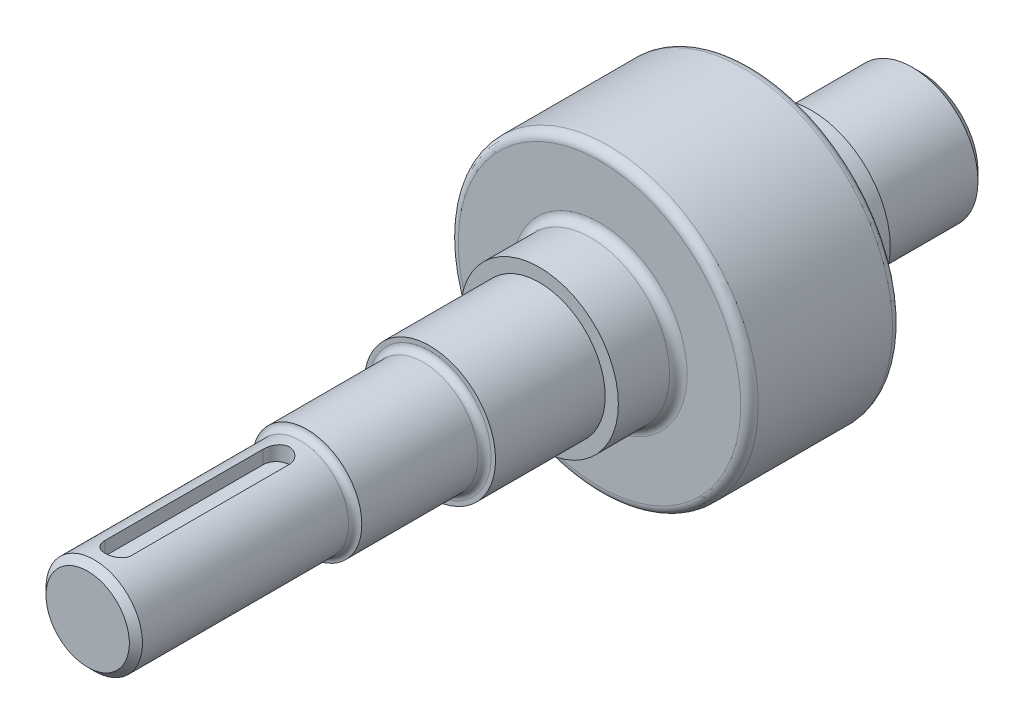
ISO-10303-21;
HEADER;
FILE_DESCRIPTION(('STEP AP214'),'2;1');
FILE_NAME('part.step','',(''),(''),'','','');
FILE_SCHEMA(('AUTOMOTIVE_DESIGN { 1 0 10303 214 1 1 1 1 }'));
ENDSEC;
DATA;
#1=APPLICATION_CONTEXT('core data for automotive mechanical design processes');
#2=APPLICATION_PROTOCOL_DEFINITION('international standard','automotive_design',2000,#1);
#3=PRODUCT_CONTEXT('',#1,'mechanical');
#4=PRODUCT('Part','Part','',(#3));
#5=PRODUCT_RELATED_PRODUCT_CATEGORY('part','',(#4));
#6=PRODUCT_DEFINITION_FORMATION('','',#4);
#7=PRODUCT_DEFINITION_CONTEXT('part definition',#1,'design');
#8=PRODUCT_DEFINITION('design','',#6,#7);
#9=PRODUCT_DEFINITION_SHAPE('','',#8);
#10=(LENGTH_UNIT() NAMED_UNIT(*) SI_UNIT(.MILLI.,.METRE.));
#11=(NAMED_UNIT(*) PLANE_ANGLE_UNIT() SI_UNIT($,.RADIAN.));
#12=(NAMED_UNIT(*) SI_UNIT($,.STERADIAN.) SOLID_ANGLE_UNIT());
#13=UNCERTAINTY_MEASURE_WITH_UNIT(LENGTH_MEASURE(1.E-05),#10,'distance_accuracy_value','');
#14=(GEOMETRIC_REPRESENTATION_CONTEXT(3) GLOBAL_UNCERTAINTY_ASSIGNED_CONTEXT((#13)) GLOBAL_UNIT_ASSIGNED_CONTEXT((#10,
#11,#12)) REPRESENTATION_CONTEXT('',''));
#15=CARTESIAN_POINT('',(0.,0.,0.));
#16=DIRECTION('',(0.,0.,1.));
#17=DIRECTION('',(1.,0.,0.));
#18=AXIS2_PLACEMENT_3D('',#15,#16,#17);
#19=CARTESIAN_POINT('',(0.,0.,0.));
#20=DIRECTION('',(0.,0.,1.));
#21=DIRECTION('',(1.,0.,0.));
#22=AXIS2_PLACEMENT_3D('',#19,#20,#21);
#23=CYLINDRICAL_SURFACE('',#22,11.);
#24=CARTESIAN_POINT('',(0.,0.,-48.5));
#25=DIRECTION('',(0.,0.,-1.));
#26=DIRECTION('',(-1.,0.,0.));
#27=AXIS2_PLACEMENT_3D('',#24,#25,#26);
#28=CIRCLE('',#27,11.);
#29=CARTESIAN_POINT('',(-11.,0.,-48.5));
#30=VERTEX_POINT('',#29);
#31=EDGE_CURVE('E271',#30,#30,#28,.F.);
#32=ORIENTED_EDGE('',*,*,#31,.T.);
#33=EDGE_LOOP('',(#32));
#34=FACE_BOUND('',#33,.T.);
#35=CARTESIAN_POINT('',(0.,0.,-1.5));
#36=DIRECTION('',(0.,0.,-1.));
#37=DIRECTION('',(-1.,0.,0.));
#38=AXIS2_PLACEMENT_3D('',#35,#36,#37);
#39=CIRCLE('',#38,11.);
#40=CARTESIAN_POINT('',(-11.,0.,-1.5));
#41=VERTEX_POINT('',#40);
#42=EDGE_CURVE('E288',#41,#41,#39,.T.);
#43=ORIENTED_EDGE('',*,*,#42,.T.);
#44=EDGE_LOOP('',(#43));
#45=FACE_BOUND('',#44,.T.);
#46=CARTESIAN_POINT('',(-3.,10.5830052442584,-43.));
#47=CARTESIAN_POINT('',(-3.00000989976809,10.5829949970026,-43.0826938914098));
#48=CARTESIAN_POINT('',(-2.99658102723594,10.5839742471726,-43.165381704592));
#49=CARTESIAN_POINT('',(-2.9829226831484,10.5878356752194,-43.3301335662288));
#50=CARTESIAN_POINT('',(-2.97269452008913,10.5907174869552,-43.4121977316291));
#51=CARTESIAN_POINT('',(-2.9455445902732,10.598299618142,-43.5749425121448));
#52=CARTESIAN_POINT('',(-2.9286377012691,10.6029958951229,-43.6556257893863));
#53=CARTESIAN_POINT('',(-2.88829120712689,10.6140571066224,-43.8152032540543));
#54=CARTESIAN_POINT('',(-2.86485147768949,10.6204220728906,-43.8940974074084));
#55=CARTESIAN_POINT('',(-2.78500332821793,10.6417494872311,-44.127242907164));
#56=CARTESIAN_POINT('',(-2.71903526586307,10.6589535681767,-44.2781393948553));
#57=CARTESIAN_POINT('',(-2.56365897700125,10.6973836998985,-44.5667053417687));
#58=CARTESIAN_POINT('',(-2.47424245636572,10.7186111730805,-44.704370097104));
#59=CARTESIAN_POINT('',(-2.27200424315806,10.7633148792344,-44.9662097059785));
#60=CARTESIAN_POINT('',(-2.15868225262836,10.7868322128172,-45.0899918782437));
#61=CARTESIAN_POINT('',(-1.91292298422355,10.8331129950831,-45.3170514389053));
#62=CARTESIAN_POINT('',(-1.78048258944453,10.8558763200935,-45.4203254772932));
#63=CARTESIAN_POINT('',(-1.49749198480952,10.8985459264206,-45.6050989067464));
#64=CARTESIAN_POINT('',(-1.34667477161624,10.9183977479742,-45.686203079821));
#65=CARTESIAN_POINT('',(-1.03291980522387,10.9525311229674,-45.8217484137797));
#66=CARTESIAN_POINT('',(-0.869984764533408,10.9668139185607,-45.8761955211319));
#67=CARTESIAN_POINT('',(-0.540744675896732,10.9879090070619,-45.9556017349027));
#68=CARTESIAN_POINT('',(-0.374613167612547,10.9948916417093,-45.9812343263694));
#69=CARTESIAN_POINT('',(-0.0402673813620298,11.0011960589752,-46.004404664847));
#70=CARTESIAN_POINT('',(0.127946573564688,11.0005190152883,-46.0019467161783));
#71=CARTESIAN_POINT('',(0.456980924404249,10.9917041066205,-45.9694751241847));
#72=CARTESIAN_POINT('',(0.617879308918079,10.9837634920705,-45.9401899732267));
#73=CARTESIAN_POINT('',(0.932383527853138,10.9615477415639,-45.8560747841413));
#74=CARTESIAN_POINT('',(1.08598900853898,10.9472722986892,-45.8012435083153));
#75=CARTESIAN_POINT('',(1.38338788045077,10.9137016176963,-45.667045133193));
#76=CARTESIAN_POINT('',(1.52706425574145,10.8943563157114,-45.5874317537612));
#77=CARTESIAN_POINT('',(1.79926098198643,10.8527253375081,-45.4061201300935));
#78=CARTESIAN_POINT('',(1.92777854091953,10.830439121215,-45.3044178271878));
#79=CARTESIAN_POINT('',(2.17034844112028,10.7844948742978,-45.0779767649162));
#80=CARTESIAN_POINT('',(2.2838069302889,10.760815765188,-44.952605446131));
#81=CARTESIAN_POINT('',(2.48826234185506,10.7153886222241,-44.6843376191299));
#82=CARTESIAN_POINT('',(2.57925300980782,10.6936411271564,-44.5414362475461));
#83=CARTESIAN_POINT('',(2.73667910615422,10.6544469945807,-44.240805187246));
#84=CARTESIAN_POINT('',(2.80293223890785,10.6370325899538,-44.0829757572429));
#85=CARTESIAN_POINT('',(2.9076832432578,10.6088816209578,-43.7579129054731));
#86=CARTESIAN_POINT('',(2.94622291362359,10.598135003286,-43.590694057725));
#87=CARTESIAN_POINT('',(2.98015870664207,10.588613232355,-43.3516455601334));
#88=CARTESIAN_POINT('',(2.98759962141261,10.5865140551644,-43.2814835402763));
#89=CARTESIAN_POINT('',(2.99751512863222,10.58371035186,-43.1408924467597));
#90=CARTESIAN_POINT('',(2.99999749605757,10.5830036423878,-43.0704639649415));
#91=CARTESIAN_POINT('',(3.00000000000001,10.5830052442584,-43.));
#92=B_SPLINE_CURVE_WITH_KNOTS('',3,(#46,#47,#48,#49,#50,#51,#52,#53,#54,#55,#56,#57,#58,#59,#60,
#61,#62,#63,#64,#65,#66,#67,#68,#69,#70,#71,#72,#73,#74,#75,#76,#77,#78,#79,#80,#81,#82,#83,#84,
#85,#86,#87,#88,#89,#90,#91),.UNSPECIFIED.,.F.,.F.,(4,2,2,2,2,2,2,2,2,2,2,2,2,2,2,2,2,2,2,2,2,2,
4),(0.,0.247994395628692,0.495941079544124,0.743338515979064,0.990740659926202,1.48499724217183,
1.97942888795731,2.48547083856628,2.99159538337128,3.50622794981868,4.02074566333957,
4.52296979924471,5.02511698025349,5.51402000992994,6.00294672920887,6.49689640600089,
6.99093691914144,7.50077286033218,8.01075056671344,8.52441550873708,9.03730408243458,
9.24891043373582,9.4601847261122),.UNSPECIFIED.);
#93=CARTESIAN_POINT('',(-3.,10.5830052442584,-43.));
#94=VERTEX_POINT('',#93);
#95=CARTESIAN_POINT('',(3.00000000000001,10.5830052442584,-43.));
#96=VERTEX_POINT('',#95);
#97=EDGE_CURVE('E90',#94,#96,#92,.T.);
#98=ORIENTED_EDGE('',*,*,#97,.T.);
#99=DIRECTION('',(0.,0.,1.));
#100=VECTOR('',#99,1.);
#101=CARTESIAN_POINT('',(3.00000000000001,10.5830052442584,0.));
#102=LINE('',#101,#100);
#103=CARTESIAN_POINT('',(3.00000000000001,10.5830052442584,-7.00000000000001));
#104=VERTEX_POINT('',#103);
#105=EDGE_CURVE('E79',#96,#104,#102,.T.);
#106=ORIENTED_EDGE('',*,*,#105,.T.);
#107=CARTESIAN_POINT('',(3.00000000000001,10.5830052442584,-7.00000000000001));
#108=CARTESIAN_POINT('',(3.0000098997681,10.5829949970026,-6.91730610859019));
#109=CARTESIAN_POINT('',(2.99658102723595,10.5839742471726,-6.83461829540797));
#110=CARTESIAN_POINT('',(2.98292268314841,10.5878356752194,-6.66986643377118));
#111=CARTESIAN_POINT('',(2.97269452008914,10.5907174869552,-6.58780226837093));
#112=CARTESIAN_POINT('',(2.94554459027321,10.598299618142,-6.42505748785524));
#113=CARTESIAN_POINT('',(2.92863770126911,10.6029958951229,-6.34437421061367));
#114=CARTESIAN_POINT('',(2.8882912071269,10.6140571066224,-6.18479674594574));
#115=CARTESIAN_POINT('',(2.8648514776895,10.6204220728906,-6.10590259259162));
#116=CARTESIAN_POINT('',(2.78500332821794,10.6417494872311,-5.872757092836));
#117=CARTESIAN_POINT('',(2.71903526586308,10.6589535681767,-5.72186060514475));
#118=CARTESIAN_POINT('',(2.56365897700126,10.6973836998985,-5.43329465823132));
#119=CARTESIAN_POINT('',(2.47424245636572,10.7186111730805,-5.29562990289597));
#120=CARTESIAN_POINT('',(2.27200424315807,10.7633148792344,-5.0337902940215));
#121=CARTESIAN_POINT('',(2.15868225262837,10.7868322128172,-4.91000812175633));
#122=CARTESIAN_POINT('',(1.91292298422355,10.8331129950831,-4.68294856109473));
#123=CARTESIAN_POINT('',(1.78048258944453,10.8558763200935,-4.57967452270675));
#124=CARTESIAN_POINT('',(1.49749198480952,10.8985459264206,-4.39490109325355));
#125=CARTESIAN_POINT('',(1.34667477161624,10.9183977479742,-4.31379692017903));
#126=CARTESIAN_POINT('',(1.03291980522387,10.9525311229674,-4.17825158622032));
#127=CARTESIAN_POINT('',(0.869984764533413,10.9668139185607,-4.12380447886811));
#128=CARTESIAN_POINT('',(0.540744675896737,10.9879090070619,-4.0443982650973));
#129=CARTESIAN_POINT('',(0.374613167612552,10.9948916417093,-4.01876567363063));
#130=CARTESIAN_POINT('',(0.0402673813620354,11.0011960589752,-3.99559533515301));
#131=CARTESIAN_POINT('',(-0.127946573564682,11.0005190152883,-3.99805328382166));
#132=CARTESIAN_POINT('',(-0.456980924404243,10.9917041066205,-4.0305248758153));
#133=CARTESIAN_POINT('',(-0.617879308918073,10.9837634920705,-4.05981002677334));
#134=CARTESIAN_POINT('',(-0.932383527853132,10.9615477415639,-4.14392521585875));
#135=CARTESIAN_POINT('',(-1.08598900853897,10.9472722986892,-4.19875649168474));
#136=CARTESIAN_POINT('',(-1.38338788045076,10.9137016176963,-4.33295486680702));
#137=CARTESIAN_POINT('',(-1.52706425574144,10.8943563157114,-4.41256824623875));
#138=CARTESIAN_POINT('',(-1.79926098198642,10.8527253375081,-4.59387986990652));
#139=CARTESIAN_POINT('',(-1.92777854091952,10.830439121215,-4.69558217281222));
#140=CARTESIAN_POINT('',(-2.17034844112028,10.7844948742978,-4.92202323508377));
#141=CARTESIAN_POINT('',(-2.28380693028889,10.760815765188,-5.04739455386901));
#142=CARTESIAN_POINT('',(-2.48826234185505,10.7153886222241,-5.31566238087013));
#143=CARTESIAN_POINT('',(-2.57925300980781,10.6936411271564,-5.45856375245395));
#144=CARTESIAN_POINT('',(-2.73667910615421,10.6544469945807,-5.75919481275404));
#145=CARTESIAN_POINT('',(-2.80293223890784,10.6370325899538,-5.91702424275707));
#146=CARTESIAN_POINT('',(-2.90768324325779,10.6088816209578,-6.24208709452695));
#147=CARTESIAN_POINT('',(-2.94622291362358,10.598135003286,-6.40930594227505));
#148=CARTESIAN_POINT('',(-2.98015870664206,10.588613232355,-6.64835443986661));
#149=CARTESIAN_POINT('',(-2.9875996214126,10.5865140551644,-6.71851645972366));
#150=CARTESIAN_POINT('',(-2.99751512863221,10.58371035186,-6.85910755324027));
#151=CARTESIAN_POINT('',(-2.99999749605756,10.5830036423878,-6.92953603505847));
#152=CARTESIAN_POINT('',(-3.,10.5830052442584,-7.00000000000001));
#153=B_SPLINE_CURVE_WITH_KNOTS('',3,(#107,#108,#109,#110,#111,#112,#113,#114,#115,#116,#117,
#118,#119,#120,#121,#122,#123,#124,#125,#126,#127,#128,#129,#130,#131,#132,#133,#134,#135,#136,
#137,#138,#139,#140,#141,#142,#143,#144,#145,#146,#147,#148,#149,#150,#151,#152),.UNSPECIFIED.,
.F.,.F.,(4,2,2,2,2,2,2,2,2,2,2,2,2,2,2,2,2,2,2,2,2,2,4),(0.,0.247994395628695,0.495941079544124,
0.743338515979064,0.990740659926205,1.48499724217183,1.97942888795731,2.48547083856629,
2.99159538337129,3.50622794981869,4.02074566333957,4.52296979924472,5.02511698025349,
5.51402000992994,6.00294672920887,6.49689640600088,6.99093691914144,7.50077286033218,
8.01075056671344,8.52441550873707,9.03730408243458,9.24891043373582,9.46018472611219),.UNSPECIFIED.);
#154=CARTESIAN_POINT('',(-3.,10.5830052442584,-7.00000000000001));
#155=VERTEX_POINT('',#154);
#156=EDGE_CURVE('E101',#104,#155,#153,.T.);
#157=ORIENTED_EDGE('',*,*,#156,.T.);
#158=DIRECTION('',(0.,0.,1.));
#159=VECTOR('',#158,1.);
#160=CARTESIAN_POINT('',(-3.,10.5830052442584,0.));
#161=LINE('',#160,#159);
#162=EDGE_CURVE('E97',#155,#94,#161,.F.);
#163=ORIENTED_EDGE('',*,*,#162,.T.);
#164=EDGE_LOOP('',(#98,#106,#157,#163));
#165=FACE_BOUND('',#164,.T.);
#166=ADVANCED_FACE('F41',(#34,#45,#165),#23,.T.);
#167=CARTESIAN_POINT('',(0.,0.,0.));
#168=DIRECTION('',(0.,0.,1.));
#169=DIRECTION('',(1.,0.,0.));
#170=AXIS2_PLACEMENT_3D('',#167,#168,#169);
#171=CYLINDRICAL_SURFACE('',#170,18.);
#172=CARTESIAN_POINT('',(0.,0.,-114.7));
#173=DIRECTION('',(0.,0.,-1.));
#174=DIRECTION('',(-1.,0.,0.));
#175=AXIS2_PLACEMENT_3D('',#172,#173,#174);
#176=CIRCLE('',#175,18.);
#177=CARTESIAN_POINT('',(-18.,0.,-114.7));
#178=VERTEX_POINT('',#177);
#179=EDGE_CURVE('E282',#178,#178,#176,.F.);
#180=ORIENTED_EDGE('',*,*,#179,.T.);
#181=EDGE_LOOP('',(#180));
#182=FACE_BOUND('',#181,.T.);
#183=CARTESIAN_POINT('',(0.,0.,-103.));
#184=DIRECTION('',(0.,0.,1.));
#185=DIRECTION('',(1.,0.,0.));
#186=AXIS2_PLACEMENT_3D('',#183,#184,#185);
#187=CIRCLE('',#186,18.);
#188=CARTESIAN_POINT('',(18.,0.,-103.));
#189=VERTEX_POINT('',#188);
#190=EDGE_CURVE('E264',#189,#189,#187,.T.);
#191=ORIENTED_EDGE('',*,*,#190,.F.);
#192=EDGE_LOOP('',(#191));
#193=FACE_BOUND('',#192,.T.);
#194=ADVANCED_FACE('F135',(#182,#193),#171,.T.);
#195=CARTESIAN_POINT('',(0.,0.,0.));
#196=DIRECTION('',(0.,0.,-1.));
#197=DIRECTION('',(-1.,0.,0.));
#198=AXIS2_PLACEMENT_3D('',#195,#196,#197);
#199=PLANE('',#198);
#200=CARTESIAN_POINT('',(0.,0.,0.));
#201=DIRECTION('',(0.,0.,-1.));
#202=DIRECTION('',(-1.,0.,0.));
#203=AXIS2_PLACEMENT_3D('',#200,#201,#202);
#204=CIRCLE('',#203,9.50000000000001);
#205=CARTESIAN_POINT('',(-9.50000000000001,0.,0.));
#206=VERTEX_POINT('',#205);
#207=EDGE_CURVE('E285',#206,#206,#204,.F.);
#208=ORIENTED_EDGE('',*,*,#207,.T.);
#209=EDGE_LOOP('',(#208));
#210=FACE_BOUND('',#209,.T.);
#211=ADVANCED_FACE('F142',(#210),#199,.F.);
#212=CARTESIAN_POINT('',(0.,0.,0.));
#213=DIRECTION('',(0.,0.,1.));
#214=DIRECTION('',(1.,0.,0.));
#215=AXIS2_PLACEMENT_3D('',#212,#213,#214);
#216=CYLINDRICAL_SURFACE('',#215,12.5);
#217=CARTESIAN_POINT('',(0.,0.,-76.5));
#218=DIRECTION('',(0.,0.,-1.));
#219=DIRECTION('',(-1.,0.,0.));
#220=AXIS2_PLACEMENT_3D('',#217,#218,#219);
#221=CIRCLE('',#220,12.5);
#222=CARTESIAN_POINT('',(-12.5,0.,-76.5));
#223=VERTEX_POINT('',#222);
#224=EDGE_CURVE('E261',#223,#223,#221,.F.);
#225=ORIENTED_EDGE('',*,*,#224,.T.);
#226=EDGE_LOOP('',(#225));
#227=FACE_BOUND('',#226,.T.);
#228=CARTESIAN_POINT('',(0.,0.,-50.));
#229=DIRECTION('',(0.,0.,1.));
#230=DIRECTION('',(1.,0.,0.));
#231=AXIS2_PLACEMENT_3D('',#228,#229,#230);
#232=CIRCLE('',#231,12.5);
#233=CARTESIAN_POINT('',(12.5,0.,-50.));
#234=VERTEX_POINT('',#233);
#235=EDGE_CURVE('E257',#234,#234,#232,.T.);
#236=ORIENTED_EDGE('',*,*,#235,.F.);
#237=EDGE_LOOP('',(#236));
#238=FACE_BOUND('',#237,.T.);
#239=ADVANCED_FACE('F150',(#227,#238),#216,.T.);
#240=CARTESIAN_POINT('',(0.,12.5,-78.));
#241=DIRECTION('',(0.,0.,-1.));
#242=DIRECTION('',(-1.,0.,0.));
#243=AXIS2_PLACEMENT_3D('',#240,#241,#242);
#244=PLANE('',#243);
#245=CARTESIAN_POINT('',(0.,0.,-78.));
#246=DIRECTION('',(0.,0.,-1.));
#247=DIRECTION('',(-1.,0.,0.));
#248=AXIS2_PLACEMENT_3D('',#245,#246,#247);
#249=CIRCLE('',#248,14.);
#250=CARTESIAN_POINT('',(-14.,0.,-78.));
#251=VERTEX_POINT('',#250);
#252=EDGE_CURVE('E253',#251,#251,#249,.T.);
#253=ORIENTED_EDGE('',*,*,#252,.T.);
#254=EDGE_LOOP('',(#253));
#255=FACE_BOUND('',#254,.T.);
#256=CARTESIAN_POINT('',(0.,0.,-78.));
#257=DIRECTION('',(0.,0.,1.));
#258=DIRECTION('',(1.,0.,0.));
#259=AXIS2_PLACEMENT_3D('',#256,#257,#258);
#260=CIRCLE('',#259,15.);
#261=CARTESIAN_POINT('',(15.,0.,-78.));
#262=VERTEX_POINT('',#261);
#263=EDGE_CURVE('E256',#262,#262,#260,.T.);
#264=ORIENTED_EDGE('',*,*,#263,.T.);
#265=EDGE_LOOP('',(#264));
#266=FACE_BOUND('',#265,.T.);
#267=ADVANCED_FACE('F242',(#255,#266),#244,.F.);
#268=CARTESIAN_POINT('',(0.,0.,0.));
#269=DIRECTION('',(0.,0.,1.));
#270=DIRECTION('',(1.,0.,0.));
#271=AXIS2_PLACEMENT_3D('',#268,#269,#270);
#272=CYLINDRICAL_SURFACE('',#271,15.);
#273=ORIENTED_EDGE('',*,*,#263,.F.);
#274=EDGE_LOOP('',(#273));
#275=FACE_BOUND('',#274,.T.);
#276=CARTESIAN_POINT('',(0.,0.,-103.));
#277=DIRECTION('',(0.,0.,1.));
#278=DIRECTION('',(1.,0.,0.));
#279=AXIS2_PLACEMENT_3D('',#276,#277,#278);
#280=CIRCLE('',#279,15.);
#281=CARTESIAN_POINT('',(15.,0.,-103.));
#282=VERTEX_POINT('',#281);
#283=EDGE_CURVE('E258',#282,#282,#280,.T.);
#284=ORIENTED_EDGE('',*,*,#283,.T.);
#285=EDGE_LOOP('',(#284));
#286=FACE_BOUND('',#285,.T.);
#287=ADVANCED_FACE('F222',(#275,#286),#272,.T.);
#288=CARTESIAN_POINT('',(0.,15.,-103.));
#289=DIRECTION('',(0.,0.,-1.));
#290=DIRECTION('',(-1.,0.,0.));
#291=AXIS2_PLACEMENT_3D('',#288,#289,#290);
#292=PLANE('',#291);
#293=ORIENTED_EDGE('',*,*,#283,.F.);
#294=EDGE_LOOP('',(#293));
#295=FACE_BOUND('',#294,.T.);
#296=ORIENTED_EDGE('',*,*,#190,.T.);
#297=EDGE_LOOP('',(#296));
#298=FACE_BOUND('',#297,.T.);
#299=ADVANCED_FACE('F212',(#295,#298),#292,.F.);
#300=CARTESIAN_POINT('',(0.,0.,-116.7));
#301=DIRECTION('',(0.,0.,-1.));
#302=DIRECTION('',(-1.,0.,0.));
#303=AXIS2_PLACEMENT_3D('',#300,#301,#302);
#304=CYLINDRICAL_SURFACE('',#303,34.2032822);
#305=CARTESIAN_POINT('',(0.,0.,-149.3));
#306=DIRECTION('',(0.,0.,-1.));
#307=DIRECTION('',(-1.,0.,0.));
#308=AXIS2_PLACEMENT_3D('',#305,#306,#307);
#309=CIRCLE('',#308,34.2032822);
#310=CARTESIAN_POINT('',(-34.2032822,0.,-149.3));
#311=VERTEX_POINT('',#310);
#312=EDGE_CURVE('E49',#311,#311,#309,.F.);
#313=ORIENTED_EDGE('',*,*,#312,.T.);
#314=EDGE_LOOP('',(#313));
#315=FACE_BOUND('',#314,.T.);
#316=CARTESIAN_POINT('',(0.,0.,-118.7));
#317=DIRECTION('',(0.,0.,-1.));
#318=DIRECTION('',(-1.,0.,0.));
#319=AXIS2_PLACEMENT_3D('',#316,#317,#318);
#320=CIRCLE('',#319,34.2032822);
#321=CARTESIAN_POINT('',(-34.2032822,0.,-118.7));
#322=VERTEX_POINT('',#321);
#323=EDGE_CURVE('E198',#322,#322,#320,.T.);
#324=ORIENTED_EDGE('',*,*,#323,.T.);
#325=EDGE_LOOP('',(#324));
#326=FACE_BOUND('',#325,.T.);
#327=ADVANCED_FACE('F208',(#315,#326),#304,.T.);
#328=CARTESIAN_POINT('',(0.,0.,-116.7));
#329=DIRECTION('',(0.,0.,-1.));
#330=DIRECTION('',(-1.,0.,0.));
#331=AXIS2_PLACEMENT_3D('',#328,#329,#330);
#332=PLANE('',#331);
#333=CARTESIAN_POINT('',(0.,0.,-116.7));
#334=DIRECTION('',(0.,0.,-1.));
#335=DIRECTION('',(-1.,0.,0.));
#336=AXIS2_PLACEMENT_3D('',#333,#334,#335);
#337=CIRCLE('',#336,32.2032822);
#338=CARTESIAN_POINT('',(-32.2032822,0.,-116.7));
#339=VERTEX_POINT('',#338);
#340=EDGE_CURVE('E11',#339,#339,#337,.F.);
#341=ORIENTED_EDGE('',*,*,#340,.T.);
#342=EDGE_LOOP('',(#341));
#343=FACE_BOUND('',#342,.T.);
#344=CARTESIAN_POINT('',(0.,0.,-116.7));
#345=DIRECTION('',(0.,0.,-1.));
#346=DIRECTION('',(-1.,0.,0.));
#347=AXIS2_PLACEMENT_3D('',#344,#345,#346);
#348=CIRCLE('',#347,20.);
#349=CARTESIAN_POINT('',(-20.,0.,-116.7));
#350=VERTEX_POINT('',#349);
#351=EDGE_CURVE('E279',#350,#350,#348,.T.);
#352=ORIENTED_EDGE('',*,*,#351,.T.);
#353=EDGE_LOOP('',(#352));
#354=FACE_BOUND('',#353,.T.);
#355=ADVANCED_FACE('F211',(#343,#354),#332,.F.);
#356=CARTESIAN_POINT('',(0.,0.,-151.3));
#357=DIRECTION('',(0.,0.,-1.));
#358=DIRECTION('',(-1.,0.,0.));
#359=AXIS2_PLACEMENT_3D('',#356,#357,#358);
#360=PLANE('',#359);
#361=CARTESIAN_POINT('',(0.,0.,-151.3));
#362=DIRECTION('',(0.,0.,-1.));
#363=DIRECTION('',(-1.,0.,0.));
#364=AXIS2_PLACEMENT_3D('',#361,#362,#363);
#365=CIRCLE('',#364,32.2032822);
#366=CARTESIAN_POINT('',(-32.2032822,0.,-151.3));
#367=VERTEX_POINT('',#366);
#368=EDGE_CURVE('E196',#367,#367,#365,.T.);
#369=ORIENTED_EDGE('',*,*,#368,.T.);
#370=EDGE_LOOP('',(#369));
#371=FACE_BOUND('',#370,.T.);
#372=CARTESIAN_POINT('',(0.,0.,-151.3));
#373=DIRECTION('',(0.,0.,-1.));
#374=DIRECTION('',(-1.,0.,0.));
#375=AXIS2_PLACEMENT_3D('',#372,#373,#374);
#376=CIRCLE('',#375,20.);
#377=CARTESIAN_POINT('',(-20.,0.,-151.3));
#378=VERTEX_POINT('',#377);
#379=EDGE_CURVE('E276',#378,#378,#376,.F.);
#380=ORIENTED_EDGE('',*,*,#379,.T.);
#381=EDGE_LOOP('',(#380));
#382=FACE_BOUND('',#381,.T.);
#383=ADVANCED_FACE('F219',(#371,#382),#360,.T.);
#384=CARTESIAN_POINT('',(0.,15.,-190.));
#385=DIRECTION('',(0.,0.,1.));
#386=DIRECTION('',(1.,0.,0.));
#387=AXIS2_PLACEMENT_3D('',#384,#385,#386);
#388=PLANE('',#387);
#389=CARTESIAN_POINT('',(0.,0.,-190.));
#390=DIRECTION('',(0.,0.,1.));
#391=DIRECTION('',(1.,0.,0.));
#392=AXIS2_PLACEMENT_3D('',#389,#390,#391);
#393=CIRCLE('',#392,13.0000000000001);
#394=CARTESIAN_POINT('',(13.0000000000001,0.,-190.));
#395=VERTEX_POINT('',#394);
#396=EDGE_CURVE('E199',#395,#395,#393,.F.);
#397=ORIENTED_EDGE('',*,*,#396,.T.);
#398=EDGE_LOOP('',(#397));
#399=FACE_BOUND('',#398,.T.);
#400=ADVANCED_FACE('F227',(#399),#388,.F.);
#401=CARTESIAN_POINT('',(0.,0.,0.));
#402=DIRECTION('',(0.,0.,1.));
#403=DIRECTION('',(1.,0.,0.));
#404=AXIS2_PLACEMENT_3D('',#401,#402,#403);
#405=CYLINDRICAL_SURFACE('',#404,15.);
#406=CARTESIAN_POINT('',(0.,0.,-188.));
#407=DIRECTION('',(0.,0.,1.));
#408=DIRECTION('',(1.,0.,0.));
#409=AXIS2_PLACEMENT_3D('',#406,#407,#408);
#410=CIRCLE('',#409,15.);
#411=CARTESIAN_POINT('',(15.,0.,-188.));
#412=VERTEX_POINT('',#411);
#413=EDGE_CURVE('E204',#412,#412,#410,.T.);
#414=ORIENTED_EDGE('',*,*,#413,.T.);
#415=EDGE_LOOP('',(#414));
#416=FACE_BOUND('',#415,.T.);
#417=CARTESIAN_POINT('',(0.,0.,-165.));
#418=DIRECTION('',(0.,0.,1.));
#419=DIRECTION('',(1.,0.,0.));
#420=AXIS2_PLACEMENT_3D('',#417,#418,#419);
#421=CIRCLE('',#420,15.);
#422=CARTESIAN_POINT('',(15.,0.,-165.));
#423=VERTEX_POINT('',#422);
#424=EDGE_CURVE('E84',#423,#423,#421,.T.);
#425=ORIENTED_EDGE('',*,*,#424,.F.);
#426=EDGE_LOOP('',(#425));
#427=FACE_BOUND('',#426,.T.);
#428=ADVANCED_FACE('F230',(#416,#427),#405,.T.);
#429=CARTESIAN_POINT('',(0.,18.,-165.));
#430=DIRECTION('',(0.,0.,1.));
#431=DIRECTION('',(1.,0.,0.));
#432=AXIS2_PLACEMENT_3D('',#429,#430,#431);
#433=PLANE('',#432);
#434=CARTESIAN_POINT('',(0.,0.,-165.));
#435=DIRECTION('',(0.,0.,1.));
#436=DIRECTION('',(1.,0.,0.));
#437=AXIS2_PLACEMENT_3D('',#434,#435,#436);
#438=CIRCLE('',#437,18.);
#439=CARTESIAN_POINT('',(18.,0.,-165.));
#440=VERTEX_POINT('',#439);
#441=EDGE_CURVE('E297',#440,#440,#438,.T.);
#442=ORIENTED_EDGE('',*,*,#441,.F.);
#443=EDGE_LOOP('',(#442));
#444=FACE_BOUND('',#443,.T.);
#445=ORIENTED_EDGE('',*,*,#424,.T.);
#446=EDGE_LOOP('',(#445));
#447=FACE_BOUND('',#446,.T.);
#448=ADVANCED_FACE('F234',(#444,#447),#433,.F.);
#449=CARTESIAN_POINT('',(0.,0.,-153.3));
#450=DIRECTION('',(0.,0.,-1.));
#451=DIRECTION('',(-1.,0.,0.));
#452=AXIS2_PLACEMENT_3D('',#449,#450,#451);
#453=CIRCLE('',#452,18.);
#454=CARTESIAN_POINT('',(-18.,0.,-153.3));
#455=VERTEX_POINT('',#454);
#456=EDGE_CURVE('E273',#455,#455,#453,.T.);
#457=ORIENTED_EDGE('',*,*,#456,.T.);
#458=EDGE_LOOP('',(#457));
#459=FACE_BOUND('',#458,.T.);
#460=ORIENTED_EDGE('',*,*,#441,.T.);
#461=EDGE_LOOP('',(#460));
#462=FACE_BOUND('',#461,.T.);
#463=ADVANCED_FACE('F145',(#459,#462),#171,.T.);
#464=CARTESIAN_POINT('',(0.,0.,-76.5));
#465=DIRECTION('',(0.,0.,-1.));
#466=DIRECTION('',(-1.,0.,0.));
#467=AXIS2_PLACEMENT_3D('',#464,#465,#466);
#468=TOROIDAL_SURFACE('',#467,14.,1.5);
#469=ORIENTED_EDGE('',*,*,#252,.F.);
#470=EDGE_LOOP('',(#469));
#471=FACE_BOUND('',#470,.T.);
#472=ORIENTED_EDGE('',*,*,#224,.F.);
#473=EDGE_LOOP('',(#472));
#474=FACE_BOUND('',#473,.T.);
#475=ADVANCED_FACE('F155',(#471,#474),#468,.F.);
#476=CARTESIAN_POINT('',(0.,0.,-48.5));
#477=DIRECTION('',(0.,0.,-1.));
#478=DIRECTION('',(-1.,0.,0.));
#479=AXIS2_PLACEMENT_3D('',#476,#477,#478);
#480=TOROIDAL_SURFACE('',#479,12.5,1.5);
#481=ORIENTED_EDGE('',*,*,#235,.T.);
#482=EDGE_LOOP('',(#481));
#483=FACE_BOUND('',#482,.T.);
#484=ORIENTED_EDGE('',*,*,#31,.F.);
#485=EDGE_LOOP('',(#484));
#486=FACE_BOUND('',#485,.T.);
#487=ADVANCED_FACE('F158',(#483,#486),#480,.F.);
#488=CARTESIAN_POINT('',(0.,0.,-153.3));
#489=DIRECTION('',(0.,0.,-1.));
#490=DIRECTION('',(-1.,0.,0.));
#491=AXIS2_PLACEMENT_3D('',#488,#489,#490);
#492=TOROIDAL_SURFACE('',#491,20.,2.);
#493=ORIENTED_EDGE('',*,*,#379,.F.);
#494=EDGE_LOOP('',(#493));
#495=FACE_BOUND('',#494,.T.);
#496=ORIENTED_EDGE('',*,*,#456,.F.);
#497=EDGE_LOOP('',(#496));
#498=FACE_BOUND('',#497,.T.);
#499=ADVANCED_FACE('F162',(#495,#498),#492,.F.);
#500=CARTESIAN_POINT('',(0.,0.,-114.7));
#501=DIRECTION('',(0.,0.,-1.));
#502=DIRECTION('',(-1.,0.,0.));
#503=AXIS2_PLACEMENT_3D('',#500,#501,#502);
#504=TOROIDAL_SURFACE('',#503,20.,2.);
#505=ORIENTED_EDGE('',*,*,#179,.F.);
#506=EDGE_LOOP('',(#505));
#507=FACE_BOUND('',#506,.T.);
#508=ORIENTED_EDGE('',*,*,#351,.F.);
#509=EDGE_LOOP('',(#508));
#510=FACE_BOUND('',#509,.T.);
#511=ADVANCED_FACE('F166',(#507,#510),#504,.F.);
#512=CARTESIAN_POINT('',(0.,0.,0.));
#513=DIRECTION('',(0.,0.,-1.));
#514=DIRECTION('',(-1.,0.,0.));
#515=AXIS2_PLACEMENT_3D('',#512,#513,#514);
#516=CONICAL_SURFACE('',#515,9.50000000000001,0.785398163397445);
#517=ORIENTED_EDGE('',*,*,#42,.F.);
#518=EDGE_LOOP('',(#517));
#519=FACE_BOUND('',#518,.T.);
#520=ORIENTED_EDGE('',*,*,#207,.F.);
#521=EDGE_LOOP('',(#520));
#522=FACE_BOUND('',#521,.T.);
#523=ADVANCED_FACE('F170',(#519,#522),#516,.T.);
#524=CARTESIAN_POINT('',(0.,0.,-188.));
#525=DIRECTION('',(0.,0.,1.));
#526=DIRECTION('',(1.,0.,0.));
#527=AXIS2_PLACEMENT_3D('',#524,#525,#526);
#528=CONICAL_SURFACE('',#527,15.,0.785398163397452);
#529=ORIENTED_EDGE('',*,*,#396,.F.);
#530=EDGE_LOOP('',(#529));
#531=FACE_BOUND('',#530,.T.);
#532=ORIENTED_EDGE('',*,*,#413,.F.);
#533=EDGE_LOOP('',(#532));
#534=FACE_BOUND('',#533,.T.);
#535=ADVANCED_FACE('F178',(#531,#534),#528,.T.);
#536=CARTESIAN_POINT('',(0.,0.,-149.3));
#537=DIRECTION('',(0.,0.,-1.));
#538=DIRECTION('',(-1.,0.,0.));
#539=AXIS2_PLACEMENT_3D('',#536,#537,#538);
#540=TOROIDAL_SURFACE('',#539,32.2032822,2.);
#541=ORIENTED_EDGE('',*,*,#312,.F.);
#542=EDGE_LOOP('',(#541));
#543=FACE_BOUND('',#542,.T.);
#544=ORIENTED_EDGE('',*,*,#368,.F.);
#545=EDGE_LOOP('',(#544));
#546=FACE_BOUND('',#545,.T.);
#547=ADVANCED_FACE('F183',(#543,#546),#540,.T.);
#548=CARTESIAN_POINT('',(0.,0.,-118.7));
#549=DIRECTION('',(0.,0.,-1.));
#550=DIRECTION('',(-1.,0.,0.));
#551=AXIS2_PLACEMENT_3D('',#548,#549,#550);
#552=TOROIDAL_SURFACE('',#551,32.2032822,2.);
#553=ORIENTED_EDGE('',*,*,#340,.F.);
#554=EDGE_LOOP('',(#553));
#555=FACE_BOUND('',#554,.T.);
#556=ORIENTED_EDGE('',*,*,#323,.F.);
#557=EDGE_LOOP('',(#556));
#558=FACE_BOUND('',#557,.T.);
#559=ADVANCED_FACE('F43',(#555,#558),#552,.T.);
#560=CARTESIAN_POINT('',(0.,34.2042822,-43.));
#561=DIRECTION('',(0.,-1.,0.));
#562=DIRECTION('',(0.,0.,-1.));
#563=AXIS2_PLACEMENT_3D('',#560,#561,#562);
#564=CYLINDRICAL_SURFACE('',#563,3.);
#565=DIRECTION('',(0.,-1.,0.));
#566=VECTOR('',#565,1.);
#567=CARTESIAN_POINT('',(-3.,34.2042822,-43.));
#568=LINE('',#567,#566);
#569=CARTESIAN_POINT('',(-3.,7.5,-43.));
#570=VERTEX_POINT('',#569);
#571=EDGE_CURVE('E85',#94,#570,#568,.T.);
#572=ORIENTED_EDGE('',*,*,#571,.T.);
#573=CARTESIAN_POINT('',(0.,7.5,-43.));
#574=DIRECTION('',(0.,1.,0.));
#575=DIRECTION('',(0.,0.,1.));
#576=AXIS2_PLACEMENT_3D('',#573,#574,#575);
#577=CIRCLE('',#576,3.);
#578=CARTESIAN_POINT('',(3.00000000000001,7.5,-43.));
#579=VERTEX_POINT('',#578);
#580=EDGE_CURVE('E93',#579,#570,#577,.T.);
#581=ORIENTED_EDGE('',*,*,#580,.F.);
#582=DIRECTION('',(0.,-1.,0.));
#583=VECTOR('',#582,1.);
#584=CARTESIAN_POINT('',(3.00000000000001,34.2042822,-43.));
#585=LINE('',#584,#583);
#586=EDGE_CURVE('E61',#96,#579,#585,.T.);
#587=ORIENTED_EDGE('',*,*,#586,.F.);
#588=ORIENTED_EDGE('',*,*,#97,.F.);
#589=EDGE_LOOP('',(#572,#581,#587,#588));
#590=FACE_BOUND('',#589,.T.);
#591=ADVANCED_FACE('F89',(#590),#564,.F.);
#592=CARTESIAN_POINT('',(-3.,34.2042822,-43.));
#593=DIRECTION('',(1.,0.,0.));
#594=DIRECTION('',(0.,0.,-1.));
#595=AXIS2_PLACEMENT_3D('',#592,#593,#594);
#596=PLANE('',#595);
#597=DIRECTION('',(0.,-1.,0.));
#598=VECTOR('',#597,1.);
#599=CARTESIAN_POINT('',(-3.,34.2042822,-7.00000000000001));
#600=LINE('',#599,#598);
#601=CARTESIAN_POINT('',(-3.,7.5,-7.00000000000001));
#602=VERTEX_POINT('',#601);
#603=EDGE_CURVE('E307',#155,#602,#600,.T.);
#604=ORIENTED_EDGE('',*,*,#603,.T.);
#605=DIRECTION('',(0.,0.,1.));
#606=VECTOR('',#605,1.);
#607=CARTESIAN_POINT('',(-3.,7.5,-43.));
#608=LINE('',#607,#606);
#609=EDGE_CURVE('E99',#570,#602,#608,.T.);
#610=ORIENTED_EDGE('',*,*,#609,.F.);
#611=ORIENTED_EDGE('',*,*,#571,.F.);
#612=ORIENTED_EDGE('',*,*,#162,.F.);
#613=EDGE_LOOP('',(#604,#610,#611,#612));
#614=FACE_BOUND('',#613,.T.);
#615=ADVANCED_FACE('F127',(#614),#596,.T.);
#616=CARTESIAN_POINT('',(0.,34.2042822,-7.00000000000001));
#617=DIRECTION('',(0.,-1.,0.));
#618=DIRECTION('',(0.,0.,-1.));
#619=AXIS2_PLACEMENT_3D('',#616,#617,#618);
#620=CYLINDRICAL_SURFACE('',#619,3.);
#621=DIRECTION('',(0.,-1.,0.));
#622=VECTOR('',#621,1.);
#623=CARTESIAN_POINT('',(3.00000000000001,34.2042822,-7.00000000000001));
#624=LINE('',#623,#622);
#625=CARTESIAN_POINT('',(3.00000000000001,7.5,-7.00000000000001));
#626=VERTEX_POINT('',#625);
#627=EDGE_CURVE('E56',#104,#626,#624,.T.);
#628=ORIENTED_EDGE('',*,*,#627,.T.);
#629=CARTESIAN_POINT('',(0.,7.5,-7.00000000000001));
#630=DIRECTION('',(0.,1.,0.));
#631=DIRECTION('',(0.,0.,1.));
#632=AXIS2_PLACEMENT_3D('',#629,#630,#631);
#633=CIRCLE('',#632,3.);
#634=EDGE_CURVE('E311',#602,#626,#633,.T.);
#635=ORIENTED_EDGE('',*,*,#634,.F.);
#636=ORIENTED_EDGE('',*,*,#603,.F.);
#637=ORIENTED_EDGE('',*,*,#156,.F.);
#638=EDGE_LOOP('',(#628,#635,#636,#637));
#639=FACE_BOUND('',#638,.T.);
#640=ADVANCED_FACE('F124',(#639),#620,.F.);
#641=CARTESIAN_POINT('',(3.00000000000001,34.2042822,-43.));
#642=DIRECTION('',(-1.,0.,0.));
#643=DIRECTION('',(0.,0.,1.));
#644=AXIS2_PLACEMENT_3D('',#641,#642,#643);
#645=PLANE('',#644);
#646=ORIENTED_EDGE('',*,*,#586,.T.);
#647=DIRECTION('',(0.,0.,-1.));
#648=VECTOR('',#647,1.);
#649=CARTESIAN_POINT('',(3.00000000000001,7.5,-43.));
#650=LINE('',#649,#648);
#651=EDGE_CURVE('E94',#626,#579,#650,.T.);
#652=ORIENTED_EDGE('',*,*,#651,.F.);
#653=ORIENTED_EDGE('',*,*,#627,.F.);
#654=ORIENTED_EDGE('',*,*,#105,.F.);
#655=EDGE_LOOP('',(#646,#652,#653,#654));
#656=FACE_BOUND('',#655,.T.);
#657=ADVANCED_FACE('F80',(#656),#645,.T.);
#658=CARTESIAN_POINT('',(0.,7.5,-43.));
#659=DIRECTION('',(0.,1.,0.));
#660=DIRECTION('',(0.,0.,1.));
#661=AXIS2_PLACEMENT_3D('',#658,#659,#660);
#662=PLANE('',#661);
#663=ORIENTED_EDGE('',*,*,#580,.T.);
#664=ORIENTED_EDGE('',*,*,#609,.T.);
#665=ORIENTED_EDGE('',*,*,#634,.T.);
#666=ORIENTED_EDGE('',*,*,#651,.T.);
#667=EDGE_LOOP('',(#663,#664,#665,#666));
#668=FACE_BOUND('',#667,.T.);
#669=ADVANCED_FACE('F116',(#668),#662,.T.);
#670=CLOSED_SHELL('',(#166,#194,#211,#239,#267,#287,#299,#327,#355,#383,#400,#428,#448,#463,
#475,#487,#499,#511,#523,#535,#547,#559,#591,#615,#640,#657,#669));
#671=MANIFOLD_SOLID_BREP('B2',#670);
#672=ADVANCED_BREP_SHAPE_REPRESENTATION('',(#18,#671),#14);
#673=SHAPE_DEFINITION_REPRESENTATION(#9,#672);
ENDSEC;
END-ISO-10303-21;
